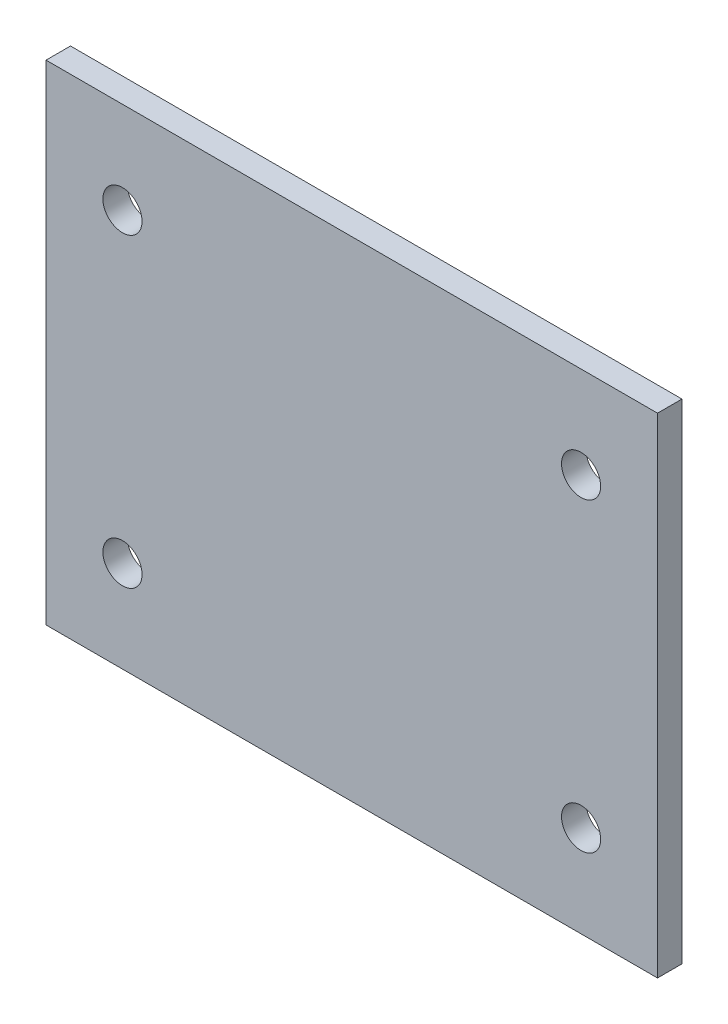
ISO-10303-21;
HEADER;
FILE_DESCRIPTION(('STEP AP214'),'2;1');
FILE_NAME('part.step','',(''),(''),'','','');
FILE_SCHEMA(('AUTOMOTIVE_DESIGN { 1 0 10303 214 1 1 1 1 }'));
ENDSEC;
DATA;
#1=APPLICATION_CONTEXT('core data for automotive mechanical design processes');
#2=APPLICATION_PROTOCOL_DEFINITION('international standard','automotive_design',2000,#1);
#3=PRODUCT_CONTEXT('',#1,'mechanical');
#4=PRODUCT('Part','Part','',(#3));
#5=PRODUCT_RELATED_PRODUCT_CATEGORY('part','',(#4));
#6=PRODUCT_DEFINITION_FORMATION('','',#4);
#7=PRODUCT_DEFINITION_CONTEXT('part definition',#1,'design');
#8=PRODUCT_DEFINITION('design','',#6,#7);
#9=PRODUCT_DEFINITION_SHAPE('','',#8);
#10=(LENGTH_UNIT() NAMED_UNIT(*) SI_UNIT(.MILLI.,.METRE.));
#11=(NAMED_UNIT(*) PLANE_ANGLE_UNIT() SI_UNIT($,.RADIAN.));
#12=(NAMED_UNIT(*) SI_UNIT($,.STERADIAN.) SOLID_ANGLE_UNIT());
#13=UNCERTAINTY_MEASURE_WITH_UNIT(LENGTH_MEASURE(1.E-05),#10,'distance_accuracy_value','');
#14=(GEOMETRIC_REPRESENTATION_CONTEXT(3) GLOBAL_UNCERTAINTY_ASSIGNED_CONTEXT((#13)) GLOBAL_UNIT_ASSIGNED_CONTEXT((#10,
#11,#12)) REPRESENTATION_CONTEXT('',''));
#15=CARTESIAN_POINT('',(0.,0.,0.));
#16=DIRECTION('',(0.,0.,1.));
#17=DIRECTION('',(1.,0.,0.));
#18=AXIS2_PLACEMENT_3D('',#15,#16,#17);
#19=CARTESIAN_POINT('',(50.,0.,4.));
#20=DIRECTION('',(1.,0.,0.));
#21=DIRECTION('',(0.,1.,0.));
#22=AXIS2_PLACEMENT_3D('',#19,#20,#21);
#23=PLANE('',#22);
#24=DIRECTION('',(0.,-1.,0.));
#25=VECTOR('',#24,1.);
#26=CARTESIAN_POINT('',(50.,0.,0.));
#27=LINE('',#26,#25);
#28=CARTESIAN_POINT('',(50.,40.,0.));
#29=VERTEX_POINT('',#28);
#30=CARTESIAN_POINT('',(50.,-40.,0.));
#31=VERTEX_POINT('',#30);
#32=EDGE_CURVE('E131',#29,#31,#27,.T.);
#33=ORIENTED_EDGE('',*,*,#32,.F.);
#34=DIRECTION('',(0.,0.,-1.));
#35=VECTOR('',#34,1.);
#36=CARTESIAN_POINT('',(50.,40.,4.));
#37=LINE('',#36,#35);
#38=CARTESIAN_POINT('',(50.,40.,4.));
#39=VERTEX_POINT('',#38);
#40=EDGE_CURVE('E11',#39,#29,#37,.T.);
#41=ORIENTED_EDGE('',*,*,#40,.F.);
#42=DIRECTION('',(0.,-1.,0.));
#43=VECTOR('',#42,1.);
#44=CARTESIAN_POINT('',(50.,0.,4.));
#45=LINE('',#44,#43);
#46=CARTESIAN_POINT('',(50.,-40.,4.));
#47=VERTEX_POINT('',#46);
#48=EDGE_CURVE('E105',#39,#47,#45,.T.);
#49=ORIENTED_EDGE('',*,*,#48,.T.);
#50=DIRECTION('',(0.,0.,-1.));
#51=VECTOR('',#50,1.);
#52=CARTESIAN_POINT('',(50.,-40.,4.));
#53=LINE('',#52,#51);
#54=EDGE_CURVE('E82',#47,#31,#53,.T.);
#55=ORIENTED_EDGE('',*,*,#54,.T.);
#56=EDGE_LOOP('',(#33,#41,#49,#55));
#57=FACE_BOUND('',#56,.T.);
#58=ADVANCED_FACE('F41',(#57),#23,.T.);
#59=CARTESIAN_POINT('',(0.,40.,4.));
#60=DIRECTION('',(0.,1.,0.));
#61=DIRECTION('',(0.,0.,1.));
#62=AXIS2_PLACEMENT_3D('',#59,#60,#61);
#63=PLANE('',#62);
#64=DIRECTION('',(1.,0.,0.));
#65=VECTOR('',#64,1.);
#66=CARTESIAN_POINT('',(0.,40.,0.));
#67=LINE('',#66,#65);
#68=CARTESIAN_POINT('',(-50.,40.,0.));
#69=VERTEX_POINT('',#68);
#70=EDGE_CURVE('E94',#69,#29,#67,.T.);
#71=ORIENTED_EDGE('',*,*,#70,.F.);
#72=DIRECTION('',(0.,0.,-1.));
#73=VECTOR('',#72,1.);
#74=CARTESIAN_POINT('',(-50.,40.,4.));
#75=LINE('',#74,#73);
#76=CARTESIAN_POINT('',(-50.,40.,4.));
#77=VERTEX_POINT('',#76);
#78=EDGE_CURVE('E51',#77,#69,#75,.T.);
#79=ORIENTED_EDGE('',*,*,#78,.F.);
#80=DIRECTION('',(1.,0.,0.));
#81=VECTOR('',#80,1.);
#82=CARTESIAN_POINT('',(0.,40.,4.));
#83=LINE('',#82,#81);
#84=EDGE_CURVE('E92',#77,#39,#83,.T.);
#85=ORIENTED_EDGE('',*,*,#84,.T.);
#86=ORIENTED_EDGE('',*,*,#40,.T.);
#87=EDGE_LOOP('',(#71,#79,#85,#86));
#88=FACE_BOUND('',#87,.T.);
#89=ADVANCED_FACE('F90',(#88),#63,.T.);
#90=CARTESIAN_POINT('',(-50.,0.,4.));
#91=DIRECTION('',(1.,0.,0.));
#92=DIRECTION('',(0.,1.,0.));
#93=AXIS2_PLACEMENT_3D('',#90,#91,#92);
#94=PLANE('',#93);
#95=DIRECTION('',(0.,-1.,0.));
#96=VECTOR('',#95,1.);
#97=CARTESIAN_POINT('',(-50.,0.,0.));
#98=LINE('',#97,#96);
#99=CARTESIAN_POINT('',(-50.,-40.,0.));
#100=VERTEX_POINT('',#99);
#101=EDGE_CURVE('E136',#69,#100,#98,.T.);
#102=ORIENTED_EDGE('',*,*,#101,.T.);
#103=DIRECTION('',(0.,0.,-1.));
#104=VECTOR('',#103,1.);
#105=CARTESIAN_POINT('',(-50.,-40.,4.));
#106=LINE('',#105,#104);
#107=CARTESIAN_POINT('',(-50.,-40.,4.));
#108=VERTEX_POINT('',#107);
#109=EDGE_CURVE('E98',#108,#100,#106,.T.);
#110=ORIENTED_EDGE('',*,*,#109,.F.);
#111=DIRECTION('',(0.,-1.,0.));
#112=VECTOR('',#111,1.);
#113=CARTESIAN_POINT('',(-50.,0.,4.));
#114=LINE('',#113,#112);
#115=EDGE_CURVE('E100',#77,#108,#114,.T.);
#116=ORIENTED_EDGE('',*,*,#115,.F.);
#117=ORIENTED_EDGE('',*,*,#78,.T.);
#118=EDGE_LOOP('',(#102,#110,#116,#117));
#119=FACE_BOUND('',#118,.T.);
#120=ADVANCED_FACE('F101',(#119),#94,.F.);
#121=CARTESIAN_POINT('',(-37.5,25.,4.));
#122=DIRECTION('',(0.,0.,-1.));
#123=DIRECTION('',(-1.,0.,0.));
#124=AXIS2_PLACEMENT_3D('',#121,#122,#123);
#125=CYLINDRICAL_SURFACE('',#124,3.2);
#126=CARTESIAN_POINT('',(-37.5,25.,4.));
#127=DIRECTION('',(0.,0.,1.));
#128=DIRECTION('',(1.,0.,0.));
#129=AXIS2_PLACEMENT_3D('',#126,#127,#128);
#130=CIRCLE('',#129,3.2);
#131=CARTESIAN_POINT('',(-34.3,25.,4.));
#132=VERTEX_POINT('',#131);
#133=EDGE_CURVE('E109',#132,#132,#130,.T.);
#134=ORIENTED_EDGE('',*,*,#133,.T.);
#135=EDGE_LOOP('',(#134));
#136=FACE_BOUND('',#135,.T.);
#137=CARTESIAN_POINT('',(-37.5,25.,0.));
#138=DIRECTION('',(0.,0.,1.));
#139=DIRECTION('',(1.,0.,0.));
#140=AXIS2_PLACEMENT_3D('',#137,#138,#139);
#141=CIRCLE('',#140,3.2);
#142=CARTESIAN_POINT('',(-34.3,25.,0.));
#143=VERTEX_POINT('',#142);
#144=EDGE_CURVE('E127',#143,#143,#141,.T.);
#145=ORIENTED_EDGE('',*,*,#144,.F.);
#146=EDGE_LOOP('',(#145));
#147=FACE_BOUND('',#146,.T.);
#148=ADVANCED_FACE('F156',(#136,#147),#125,.F.);
#149=CARTESIAN_POINT('',(37.5,-25.,4.));
#150=DIRECTION('',(0.,0.,-1.));
#151=DIRECTION('',(-1.,0.,0.));
#152=AXIS2_PLACEMENT_3D('',#149,#150,#151);
#153=CYLINDRICAL_SURFACE('',#152,3.2);
#154=CARTESIAN_POINT('',(37.5,-25.,4.));
#155=DIRECTION('',(0.,0.,1.));
#156=DIRECTION('',(1.,0.,0.));
#157=AXIS2_PLACEMENT_3D('',#154,#155,#156);
#158=CIRCLE('',#157,3.2);
#159=CARTESIAN_POINT('',(40.7,-25.,4.));
#160=VERTEX_POINT('',#159);
#161=EDGE_CURVE('E262',#160,#160,#158,.T.);
#162=ORIENTED_EDGE('',*,*,#161,.T.);
#163=EDGE_LOOP('',(#162));
#164=FACE_BOUND('',#163,.T.);
#165=CARTESIAN_POINT('',(37.5,-25.,0.));
#166=DIRECTION('',(0.,0.,1.));
#167=DIRECTION('',(1.,0.,0.));
#168=AXIS2_PLACEMENT_3D('',#165,#166,#167);
#169=CIRCLE('',#168,3.2);
#170=CARTESIAN_POINT('',(40.7,-25.,0.));
#171=VERTEX_POINT('',#170);
#172=EDGE_CURVE('E123',#171,#171,#169,.T.);
#173=ORIENTED_EDGE('',*,*,#172,.F.);
#174=EDGE_LOOP('',(#173));
#175=FACE_BOUND('',#174,.T.);
#176=ADVANCED_FACE('F159',(#164,#175),#153,.F.);
#177=CARTESIAN_POINT('',(37.5,25.,4.));
#178=DIRECTION('',(0.,0.,-1.));
#179=DIRECTION('',(-1.,0.,0.));
#180=AXIS2_PLACEMENT_3D('',#177,#178,#179);
#181=CYLINDRICAL_SURFACE('',#180,3.2);
#182=CARTESIAN_POINT('',(37.5,25.,4.));
#183=DIRECTION('',(0.,0.,1.));
#184=DIRECTION('',(1.,0.,0.));
#185=AXIS2_PLACEMENT_3D('',#182,#183,#184);
#186=CIRCLE('',#185,3.2);
#187=CARTESIAN_POINT('',(40.7,25.,4.));
#188=VERTEX_POINT('',#187);
#189=EDGE_CURVE('E173',#188,#188,#186,.T.);
#190=ORIENTED_EDGE('',*,*,#189,.T.);
#191=EDGE_LOOP('',(#190));
#192=FACE_BOUND('',#191,.T.);
#193=CARTESIAN_POINT('',(37.5,25.,0.));
#194=DIRECTION('',(0.,0.,1.));
#195=DIRECTION('',(1.,0.,0.));
#196=AXIS2_PLACEMENT_3D('',#193,#194,#195);
#197=CIRCLE('',#196,3.2);
#198=CARTESIAN_POINT('',(40.7,25.,0.));
#199=VERTEX_POINT('',#198);
#200=EDGE_CURVE('E119',#199,#199,#197,.T.);
#201=ORIENTED_EDGE('',*,*,#200,.F.);
#202=EDGE_LOOP('',(#201));
#203=FACE_BOUND('',#202,.T.);
#204=ADVANCED_FACE('F162',(#192,#203),#181,.F.);
#205=CARTESIAN_POINT('',(-37.5,-25.,4.));
#206=DIRECTION('',(0.,0.,-1.));
#207=DIRECTION('',(-1.,0.,0.));
#208=AXIS2_PLACEMENT_3D('',#205,#206,#207);
#209=CYLINDRICAL_SURFACE('',#208,3.2);
#210=CARTESIAN_POINT('',(-37.5,-25.,4.));
#211=DIRECTION('',(0.,0.,1.));
#212=DIRECTION('',(1.,0.,0.));
#213=AXIS2_PLACEMENT_3D('',#210,#211,#212);
#214=CIRCLE('',#213,3.2);
#215=CARTESIAN_POINT('',(-34.3,-25.,4.));
#216=VERTEX_POINT('',#215);
#217=EDGE_CURVE('E141',#216,#216,#214,.T.);
#218=ORIENTED_EDGE('',*,*,#217,.T.);
#219=EDGE_LOOP('',(#218));
#220=FACE_BOUND('',#219,.T.);
#221=CARTESIAN_POINT('',(-37.5,-25.,0.));
#222=DIRECTION('',(0.,0.,1.));
#223=DIRECTION('',(1.,0.,0.));
#224=AXIS2_PLACEMENT_3D('',#221,#222,#223);
#225=CIRCLE('',#224,3.2);
#226=CARTESIAN_POINT('',(-34.3,-25.,0.));
#227=VERTEX_POINT('',#226);
#228=EDGE_CURVE('E115',#227,#227,#225,.T.);
#229=ORIENTED_EDGE('',*,*,#228,.F.);
#230=EDGE_LOOP('',(#229));
#231=FACE_BOUND('',#230,.T.);
#232=ADVANCED_FACE('F43',(#220,#231),#209,.F.);
#233=CARTESIAN_POINT('',(0.,-40.,4.));
#234=DIRECTION('',(0.,1.,0.));
#235=DIRECTION('',(0.,0.,1.));
#236=AXIS2_PLACEMENT_3D('',#233,#234,#235);
#237=PLANE('',#236);
#238=DIRECTION('',(1.,0.,0.));
#239=VECTOR('',#238,1.);
#240=CARTESIAN_POINT('',(0.,-40.,0.));
#241=LINE('',#240,#239);
#242=EDGE_CURVE('E75',#100,#31,#241,.T.);
#243=ORIENTED_EDGE('',*,*,#242,.T.);
#244=ORIENTED_EDGE('',*,*,#54,.F.);
#245=DIRECTION('',(1.,0.,0.));
#246=VECTOR('',#245,1.);
#247=CARTESIAN_POINT('',(0.,-40.,4.));
#248=LINE('',#247,#246);
#249=EDGE_CURVE('E59',#108,#47,#248,.T.);
#250=ORIENTED_EDGE('',*,*,#249,.F.);
#251=ORIENTED_EDGE('',*,*,#109,.T.);
#252=EDGE_LOOP('',(#243,#244,#250,#251));
#253=FACE_BOUND('',#252,.T.);
#254=ADVANCED_FACE('F146',(#253),#237,.F.);
#255=CARTESIAN_POINT('',(0.,0.,4.));
#256=DIRECTION('',(0.,0.,1.));
#257=DIRECTION('',(1.,0.,0.));
#258=AXIS2_PLACEMENT_3D('',#255,#256,#257);
#259=PLANE('',#258);
#260=ORIENTED_EDGE('',*,*,#217,.F.);
#261=EDGE_LOOP('',(#260));
#262=FACE_BOUND('',#261,.T.);
#263=ORIENTED_EDGE('',*,*,#189,.F.);
#264=EDGE_LOOP('',(#263));
#265=FACE_BOUND('',#264,.T.);
#266=ORIENTED_EDGE('',*,*,#161,.F.);
#267=EDGE_LOOP('',(#266));
#268=FACE_BOUND('',#267,.T.);
#269=ORIENTED_EDGE('',*,*,#133,.F.);
#270=EDGE_LOOP('',(#269));
#271=FACE_BOUND('',#270,.T.);
#272=ORIENTED_EDGE('',*,*,#48,.F.);
#273=ORIENTED_EDGE('',*,*,#84,.F.);
#274=ORIENTED_EDGE('',*,*,#115,.T.);
#275=ORIENTED_EDGE('',*,*,#249,.T.);
#276=EDGE_LOOP('',(#272,#273,#274,#275));
#277=FACE_BOUND('',#276,.T.);
#278=ADVANCED_FACE('F104',(#262,#265,#268,#271,#277),#259,.T.);
#279=CARTESIAN_POINT('',(0.,0.,0.));
#280=DIRECTION('',(0.,0.,1.));
#281=DIRECTION('',(1.,0.,0.));
#282=AXIS2_PLACEMENT_3D('',#279,#280,#281);
#283=PLANE('',#282);
#284=ORIENTED_EDGE('',*,*,#228,.T.);
#285=EDGE_LOOP('',(#284));
#286=FACE_BOUND('',#285,.T.);
#287=ORIENTED_EDGE('',*,*,#200,.T.);
#288=EDGE_LOOP('',(#287));
#289=FACE_BOUND('',#288,.T.);
#290=ORIENTED_EDGE('',*,*,#172,.T.);
#291=EDGE_LOOP('',(#290));
#292=FACE_BOUND('',#291,.T.);
#293=ORIENTED_EDGE('',*,*,#144,.T.);
#294=EDGE_LOOP('',(#293));
#295=FACE_BOUND('',#294,.T.);
#296=ORIENTED_EDGE('',*,*,#32,.T.);
#297=ORIENTED_EDGE('',*,*,#242,.F.);
#298=ORIENTED_EDGE('',*,*,#101,.F.);
#299=ORIENTED_EDGE('',*,*,#70,.T.);
#300=EDGE_LOOP('',(#296,#297,#298,#299));
#301=FACE_BOUND('',#300,.T.);
#302=ADVANCED_FACE('F147',(#286,#289,#292,#295,#301),#283,.F.);
#303=CLOSED_SHELL('',(#58,#89,#120,#148,#176,#204,#232,#254,#278,#302));
#304=MANIFOLD_SOLID_BREP('B2',#303);
#305=ADVANCED_BREP_SHAPE_REPRESENTATION('',(#18,#304),#14);
#306=SHAPE_DEFINITION_REPRESENTATION(#9,#305);
ENDSEC;
END-ISO-10303-21;
